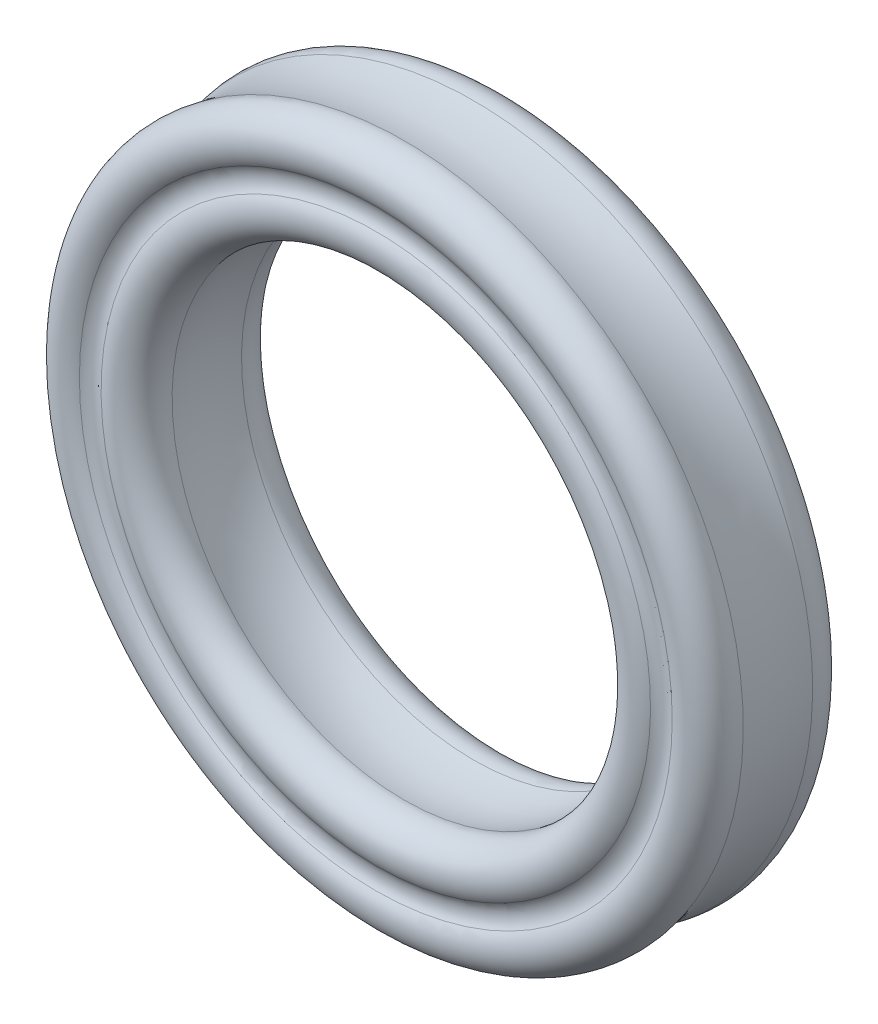
ISO-10303-21;
HEADER;
FILE_DESCRIPTION(('STEP AP214'),'2;1');
FILE_NAME('part.step','',(''),(''),'','','');
FILE_SCHEMA(('AUTOMOTIVE_DESIGN { 1 0 10303 214 1 1 1 1 }'));
ENDSEC;
DATA;
#1=APPLICATION_CONTEXT('core data for automotive mechanical design processes');
#2=APPLICATION_PROTOCOL_DEFINITION('international standard','automotive_design',2000,#1);
#3=PRODUCT_CONTEXT('',#1,'mechanical');
#4=PRODUCT('Part','Part','',(#3));
#5=PRODUCT_RELATED_PRODUCT_CATEGORY('part','',(#4));
#6=PRODUCT_DEFINITION_FORMATION('','',#4);
#7=PRODUCT_DEFINITION_CONTEXT('part definition',#1,'design');
#8=PRODUCT_DEFINITION('design','',#6,#7);
#9=PRODUCT_DEFINITION_SHAPE('','',#8);
#10=(LENGTH_UNIT() NAMED_UNIT(*) SI_UNIT(.MILLI.,.METRE.));
#11=(NAMED_UNIT(*) PLANE_ANGLE_UNIT() SI_UNIT($,.RADIAN.));
#12=(NAMED_UNIT(*) SI_UNIT($,.STERADIAN.) SOLID_ANGLE_UNIT());
#13=UNCERTAINTY_MEASURE_WITH_UNIT(LENGTH_MEASURE(1.E-05),#10,'distance_accuracy_value','');
#14=(GEOMETRIC_REPRESENTATION_CONTEXT(3) GLOBAL_UNCERTAINTY_ASSIGNED_CONTEXT((#13)) GLOBAL_UNIT_ASSIGNED_CONTEXT((#10,
#11,#12)) REPRESENTATION_CONTEXT('',''));
#15=CARTESIAN_POINT('',(0.,0.,0.));
#16=DIRECTION('',(0.,0.,1.));
#17=DIRECTION('',(1.,0.,0.));
#18=AXIS2_PLACEMENT_3D('',#15,#16,#17);
#19=CARTESIAN_POINT('',(0.,0.,0.131666666666662));
#20=DIRECTION('',(0.,0.,0.999999999999999));
#21=DIRECTION('',(0.,-1.,0.));
#22=AXIS2_PLACEMENT_3D('',#19,#20,#21);
#23=TOROIDAL_SURFACE('',#22,4.16,0.263333333333333);
#24=CARTESIAN_POINT('',(0.,0.,-0.0790000000000027));
#25=DIRECTION('',(0.,0.,0.999999999999999));
#26=DIRECTION('',(0.,-1.,0.));
#27=AXIS2_PLACEMENT_3D('',#24,#25,#26);
#28=CIRCLE('',#27,4.002);
#29=CARTESIAN_POINT('',(0.,-4.002,-0.0790000000000032));
#30=VERTEX_POINT('',#29);
#31=EDGE_CURVE('E10',#30,#30,#28,.T.);
#32=ORIENTED_EDGE('',*,*,#31,.F.);
#33=EDGE_LOOP('',(#32));
#34=FACE_BOUND('',#33,.T.);
#35=CARTESIAN_POINT('',(0.,0.,-0.0790000000000027));
#36=DIRECTION('',(0.,0.,0.999999999999999));
#37=DIRECTION('',(0.,-1.,0.));
#38=AXIS2_PLACEMENT_3D('',#35,#36,#37);
#39=CIRCLE('',#38,4.318);
#40=CARTESIAN_POINT('',(0.,-4.318,-0.0790000000000032));
#41=VERTEX_POINT('',#40);
#42=EDGE_CURVE('E53',#41,#41,#39,.T.);
#43=ORIENTED_EDGE('',*,*,#42,.T.);
#44=EDGE_LOOP('',(#43));
#45=FACE_BOUND('',#44,.T.);
#46=ADVANCED_FACE('F25',(#34,#45),#23,.F.);
#47=CARTESIAN_POINT('',(0.,0.,-0.395));
#48=DIRECTION('',(0.,0.,0.999999999999999));
#49=DIRECTION('',(0.,-1.,0.));
#50=AXIS2_PLACEMENT_3D('',#47,#48,#49);
#51=TOROIDAL_SURFACE('',#50,3.765,0.395000000000001);
#52=CARTESIAN_POINT('',(0.,0.,-0.494780793319417));
#53=DIRECTION('',(0.,0.,0.999999999999999));
#54=DIRECTION('',(0.,-1.,0.));
#55=AXIS2_PLACEMENT_3D('',#52,#53,#54);
#56=CIRCLE('',#55,3.38281052698361);
#57=CARTESIAN_POINT('',(0.,-3.3828105269836,-0.494780793319418));
#58=VERTEX_POINT('',#57);
#59=EDGE_CURVE('E31',#58,#58,#56,.T.);
#60=ORIENTED_EDGE('',*,*,#59,.F.);
#61=EDGE_LOOP('',(#60));
#62=FACE_BOUND('',#61,.T.);
#63=ORIENTED_EDGE('',*,*,#31,.T.);
#64=EDGE_LOOP('',(#63));
#65=FACE_BOUND('',#64,.T.);
#66=ADVANCED_FACE('F90',(#62,#65),#51,.T.);
#67=CARTESIAN_POINT('',(0.,0.,-1.));
#68=DIRECTION('',(0.,0.,0.999999999999999));
#69=DIRECTION('',(0.,-1.,0.));
#70=AXIS2_PLACEMENT_3D('',#67,#68,#69);
#71=DEGENERATE_TOROIDAL_SURFACE('',#70,1.44767395474871,2.,.T.);
#72=CARTESIAN_POINT('',(0.,0.,-1.50521920668058));
#73=DIRECTION('',(0.,0.,0.999999999999999));
#74=DIRECTION('',(0.,-1.,0.));
#75=AXIS2_PLACEMENT_3D('',#72,#73,#74);
#76=CIRCLE('',#75,3.3828105269836);
#77=CARTESIAN_POINT('',(0.,-3.3828105269836,-1.50521920668058));
#78=VERTEX_POINT('',#77);
#79=EDGE_CURVE('E35',#78,#78,#76,.T.);
#80=ORIENTED_EDGE('',*,*,#79,.F.);
#81=EDGE_LOOP('',(#80));
#82=FACE_BOUND('',#81,.T.);
#83=ORIENTED_EDGE('',*,*,#59,.T.);
#84=EDGE_LOOP('',(#83));
#85=FACE_BOUND('',#84,.T.);
#86=ADVANCED_FACE('F85',(#82,#85),#71,.F.);
#87=CARTESIAN_POINT('',(0.,0.,-1.605));
#88=DIRECTION('',(0.,0.,0.999999999999999));
#89=DIRECTION('',(0.,-1.,0.));
#90=AXIS2_PLACEMENT_3D('',#87,#88,#89);
#91=TOROIDAL_SURFACE('',#90,3.765,0.395000000000001);
#92=CARTESIAN_POINT('',(0.,0.,-1.921));
#93=DIRECTION('',(0.,0.,0.999999999999999));
#94=DIRECTION('',(0.,-1.,0.));
#95=AXIS2_PLACEMENT_3D('',#92,#93,#94);
#96=CIRCLE('',#95,4.002);
#97=CARTESIAN_POINT('',(0.,-4.002,-1.921));
#98=VERTEX_POINT('',#97);
#99=EDGE_CURVE('E39',#98,#98,#96,.T.);
#100=ORIENTED_EDGE('',*,*,#99,.F.);
#101=EDGE_LOOP('',(#100));
#102=FACE_BOUND('',#101,.T.);
#103=ORIENTED_EDGE('',*,*,#79,.T.);
#104=EDGE_LOOP('',(#103));
#105=FACE_BOUND('',#104,.T.);
#106=ADVANCED_FACE('F79',(#102,#105),#91,.T.);
#107=CARTESIAN_POINT('',(0.,0.,-2.13166666666666));
#108=DIRECTION('',(0.,0.,0.999999999999999));
#109=DIRECTION('',(0.,-1.,0.));
#110=AXIS2_PLACEMENT_3D('',#107,#108,#109);
#111=TOROIDAL_SURFACE('',#110,4.16,0.263333333333333);
#112=CARTESIAN_POINT('',(0.,0.,-1.921));
#113=DIRECTION('',(0.,0.,0.999999999999999));
#114=DIRECTION('',(0.,-1.,0.));
#115=AXIS2_PLACEMENT_3D('',#112,#113,#114);
#116=CIRCLE('',#115,4.318);
#117=CARTESIAN_POINT('',(0.,-4.318,-1.921));
#118=VERTEX_POINT('',#117);
#119=EDGE_CURVE('E44',#118,#118,#116,.T.);
#120=ORIENTED_EDGE('',*,*,#119,.F.);
#121=EDGE_LOOP('',(#120));
#122=FACE_BOUND('',#121,.T.);
#123=ORIENTED_EDGE('',*,*,#99,.T.);
#124=EDGE_LOOP('',(#123));
#125=FACE_BOUND('',#124,.T.);
#126=ADVANCED_FACE('F73',(#122,#125),#111,.F.);
#127=CARTESIAN_POINT('',(0.,0.,-1.605));
#128=DIRECTION('',(0.,0.,0.999999999999999));
#129=DIRECTION('',(0.,-1.,0.));
#130=AXIS2_PLACEMENT_3D('',#127,#128,#129);
#131=TOROIDAL_SURFACE('',#130,4.555,0.395000000000001);
#132=CARTESIAN_POINT('',(0.,0.,-1.50521920668058));
#133=DIRECTION('',(0.,0.,0.999999999999999));
#134=DIRECTION('',(0.,-1.,0.));
#135=AXIS2_PLACEMENT_3D('',#132,#133,#134);
#136=CIRCLE('',#135,4.9371894730164);
#137=CARTESIAN_POINT('',(0.,-4.93718947301639,-1.50521920668059));
#138=VERTEX_POINT('',#137);
#139=EDGE_CURVE('E47',#138,#138,#136,.T.);
#140=ORIENTED_EDGE('',*,*,#139,.F.);
#141=EDGE_LOOP('',(#140));
#142=FACE_BOUND('',#141,.T.);
#143=ORIENTED_EDGE('',*,*,#119,.T.);
#144=EDGE_LOOP('',(#143));
#145=FACE_BOUND('',#144,.T.);
#146=ADVANCED_FACE('F67',(#142,#145),#131,.T.);
#147=CARTESIAN_POINT('',(0.,0.,-1.));
#148=DIRECTION('',(0.,0.,0.999999999999999));
#149=DIRECTION('',(0.,-1.,0.));
#150=AXIS2_PLACEMENT_3D('',#147,#148,#149);
#151=TOROIDAL_SURFACE('',#150,6.8723260452513,2.);
#152=CARTESIAN_POINT('',(0.,0.,-0.494780793319417));
#153=DIRECTION('',(0.,0.,0.999999999999999));
#154=DIRECTION('',(0.,-1.,0.));
#155=AXIS2_PLACEMENT_3D('',#152,#153,#154);
#156=CIRCLE('',#155,4.9371894730164);
#157=CARTESIAN_POINT('',(0.,-4.9371894730164,-0.494780793319418));
#158=VERTEX_POINT('',#157);
#159=EDGE_CURVE('E50',#158,#158,#156,.T.);
#160=ORIENTED_EDGE('',*,*,#159,.F.);
#161=EDGE_LOOP('',(#160));
#162=FACE_BOUND('',#161,.T.);
#163=ORIENTED_EDGE('',*,*,#139,.T.);
#164=EDGE_LOOP('',(#163));
#165=FACE_BOUND('',#164,.T.);
#166=ADVANCED_FACE('F61',(#162,#165),#151,.F.);
#167=CARTESIAN_POINT('',(0.,0.,-0.395));
#168=DIRECTION('',(0.,0.,0.999999999999999));
#169=DIRECTION('',(0.,-1.,0.));
#170=AXIS2_PLACEMENT_3D('',#167,#168,#169);
#171=TOROIDAL_SURFACE('',#170,4.555,0.395000000000001);
#172=ORIENTED_EDGE('',*,*,#42,.F.);
#173=EDGE_LOOP('',(#172));
#174=FACE_BOUND('',#173,.T.);
#175=ORIENTED_EDGE('',*,*,#159,.T.);
#176=EDGE_LOOP('',(#175));
#177=FACE_BOUND('',#176,.T.);
#178=ADVANCED_FACE('F58',(#174,#177),#171,.T.);
#179=CLOSED_SHELL('',(#46,#66,#86,#106,#126,#146,#166,#178));
#180=MANIFOLD_SOLID_BREP('B2',#179);
#181=ADVANCED_BREP_SHAPE_REPRESENTATION('',(#18,#180),#14);
#182=SHAPE_DEFINITION_REPRESENTATION(#9,#181);
ENDSEC;
END-ISO-10303-21;
